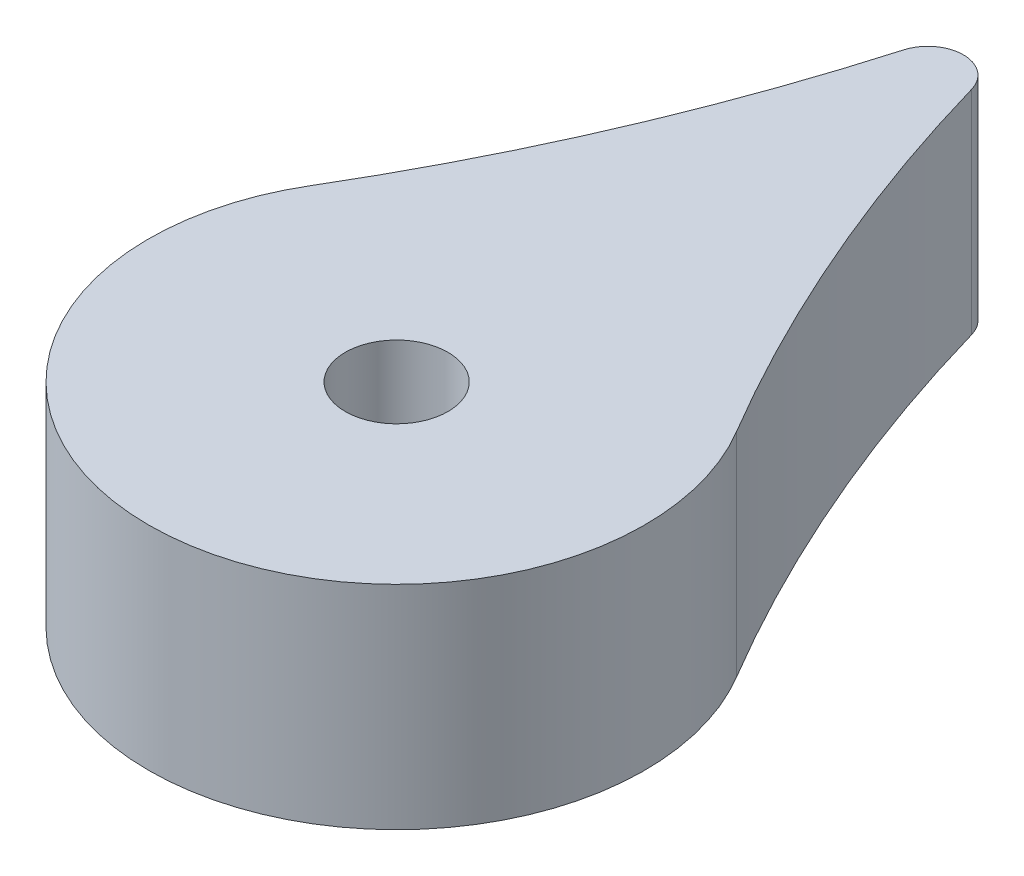
ISO-10303-21;
HEADER;
FILE_DESCRIPTION(('STEP AP214'),'2;1');
FILE_NAME('part.step','',(''),(''),'','','');
FILE_SCHEMA(('AUTOMOTIVE_DESIGN { 1 0 10303 214 1 1 1 1 }'));
ENDSEC;
DATA;
#1=APPLICATION_CONTEXT('core data for automotive mechanical design processes');
#2=APPLICATION_PROTOCOL_DEFINITION('international standard','automotive_design',2000,#1);
#3=PRODUCT_CONTEXT('',#1,'mechanical');
#4=PRODUCT('Part','Part','',(#3));
#5=PRODUCT_RELATED_PRODUCT_CATEGORY('part','',(#4));
#6=PRODUCT_DEFINITION_FORMATION('','',#4);
#7=PRODUCT_DEFINITION_CONTEXT('part definition',#1,'design');
#8=PRODUCT_DEFINITION('design','',#6,#7);
#9=PRODUCT_DEFINITION_SHAPE('','',#8);
#10=(LENGTH_UNIT() NAMED_UNIT(*) SI_UNIT(.MILLI.,.METRE.));
#11=(NAMED_UNIT(*) PLANE_ANGLE_UNIT() SI_UNIT($,.RADIAN.));
#12=(NAMED_UNIT(*) SI_UNIT($,.STERADIAN.) SOLID_ANGLE_UNIT());
#13=UNCERTAINTY_MEASURE_WITH_UNIT(LENGTH_MEASURE(1.E-05),#10,'distance_accuracy_value','');
#14=(GEOMETRIC_REPRESENTATION_CONTEXT(3) GLOBAL_UNCERTAINTY_ASSIGNED_CONTEXT((#13)) GLOBAL_UNIT_ASSIGNED_CONTEXT((#10,
#11,#12)) REPRESENTATION_CONTEXT('',''));
#15=CARTESIAN_POINT('',(0.,0.,0.));
#16=DIRECTION('',(0.,0.,1.));
#17=DIRECTION('',(1.,0.,0.));
#18=AXIS2_PLACEMENT_3D('',#15,#16,#17);
#19=CARTESIAN_POINT('',(0.,-3.,0.));
#20=DIRECTION('',(0.,1.,0.));
#21=DIRECTION('',(0.,0.,1.));
#22=AXIS2_PLACEMENT_3D('',#19,#20,#21);
#23=CYLINDRICAL_SURFACE('',#22,4.);
#24=CARTESIAN_POINT('',(0.,0.,0.));
#25=DIRECTION('',(0.,1.,0.));
#26=DIRECTION('',(0.,0.,1.));
#27=AXIS2_PLACEMENT_3D('',#24,#25,#26);
#28=CIRCLE('',#27,4.);
#29=CARTESIAN_POINT('',(-3.1224989991992,0.,-2.5));
#30=VERTEX_POINT('',#29);
#31=CARTESIAN_POINT('',(3.1224989991992,0.,-2.5));
#32=VERTEX_POINT('',#31);
#33=EDGE_CURVE('E115',#30,#32,#28,.T.);
#34=ORIENTED_EDGE('',*,*,#33,.T.);
#35=DIRECTION('',(0.,1.,0.));
#36=VECTOR('',#35,1.);
#37=CARTESIAN_POINT('',(3.1224989991992,-3.,-2.5));
#38=LINE('',#37,#36);
#39=CARTESIAN_POINT('',(3.1224989991992,-3.,-2.5));
#40=VERTEX_POINT('',#39);
#41=EDGE_CURVE('E11',#40,#32,#38,.T.);
#42=ORIENTED_EDGE('',*,*,#41,.F.);
#43=CARTESIAN_POINT('',(0.,-3.,0.));
#44=DIRECTION('',(0.,1.,0.));
#45=DIRECTION('',(0.,0.,1.));
#46=AXIS2_PLACEMENT_3D('',#43,#44,#45);
#47=CIRCLE('',#46,4.);
#48=CARTESIAN_POINT('',(-3.1224989991992,-3.,-2.5));
#49=VERTEX_POINT('',#48);
#50=EDGE_CURVE('E127',#49,#40,#47,.T.);
#51=ORIENTED_EDGE('',*,*,#50,.F.);
#52=DIRECTION('',(0.,1.,0.));
#53=VECTOR('',#52,1.);
#54=CARTESIAN_POINT('',(-3.1224989991992,-3.,-2.5));
#55=LINE('',#54,#53);
#56=EDGE_CURVE('E45',#49,#30,#55,.T.);
#57=ORIENTED_EDGE('',*,*,#56,.T.);
#58=EDGE_LOOP('',(#34,#42,#51,#57));
#59=FACE_BOUND('',#58,.T.);
#60=ADVANCED_FACE('F35',(#59),#23,.F.);
#61=CARTESIAN_POINT('',(-49.0121413529342,-3.,-29.1));
#62=DIRECTION('',(0.,1.,0.));
#63=DIRECTION('',(0.,0.,1.));
#64=AXIS2_PLACEMENT_3D('',#61,#62,#63);
#65=CYLINDRICAL_SURFACE('',#64,50.);
#66=DIRECTION('',(0.,1.,0.));
#67=VECTOR('',#66,1.);
#68=CARTESIAN_POINT('',(-6.01903490299191,-3.,-3.57368421052631));
#69=LINE('',#68,#67);
#70=CARTESIAN_POINT('',(-6.01903490299191,-3.,-3.57368421052631));
#71=VERTEX_POINT('',#70);
#72=CARTESIAN_POINT('',(-6.01903490299191,3.,-3.57368421052631));
#73=VERTEX_POINT('',#72);
#74=EDGE_CURVE('E39',#71,#73,#69,.T.);
#75=ORIENTED_EDGE('',*,*,#74,.T.);
#76=CARTESIAN_POINT('',(-49.0121413529342,3.,-29.1));
#77=DIRECTION('',(0.,1.,0.));
#78=DIRECTION('',(0.,0.,1.));
#79=AXIS2_PLACEMENT_3D('',#76,#77,#78);
#80=CIRCLE('',#79,50.);
#81=CARTESIAN_POINT('',(-0.961022379469295,3.,-15.2764705882353));
#82=VERTEX_POINT('',#81);
#83=EDGE_CURVE('E88',#73,#82,#80,.T.);
#84=ORIENTED_EDGE('',*,*,#83,.T.);
#85=DIRECTION('',(0.,1.,0.));
#86=VECTOR('',#85,1.);
#87=CARTESIAN_POINT('',(-0.961022379469295,-3.,-15.2764705882353));
#88=LINE('',#87,#86);
#89=CARTESIAN_POINT('',(-0.961022379469295,-3.,-15.2764705882353));
#90=VERTEX_POINT('',#89);
#91=EDGE_CURVE('E136',#90,#82,#88,.T.);
#92=ORIENTED_EDGE('',*,*,#91,.F.);
#93=CARTESIAN_POINT('',(-49.0121413529342,-3.,-29.1));
#94=DIRECTION('',(0.,1.,0.));
#95=DIRECTION('',(0.,0.,1.));
#96=AXIS2_PLACEMENT_3D('',#93,#94,#95);
#97=CIRCLE('',#96,50.);
#98=EDGE_CURVE('E91',#71,#90,#97,.T.);
#99=ORIENTED_EDGE('',*,*,#98,.F.);
#100=EDGE_LOOP('',(#75,#84,#92,#99));
#101=FACE_BOUND('',#100,.T.);
#102=ADVANCED_FACE('F37',(#101),#65,.F.);
#103=CARTESIAN_POINT('',(0.,-3.,-15.));
#104=DIRECTION('',(0.,1.,0.));
#105=DIRECTION('',(0.,0.,1.));
#106=AXIS2_PLACEMENT_3D('',#103,#104,#105);
#107=CYLINDRICAL_SURFACE('',#106,0.999999999999991);
#108=ORIENTED_EDGE('',*,*,#91,.T.);
#109=CARTESIAN_POINT('',(0.,3.,-15.));
#110=DIRECTION('',(0.,1.,0.));
#111=DIRECTION('',(0.,0.,1.));
#112=AXIS2_PLACEMENT_3D('',#109,#110,#111);
#113=CIRCLE('',#112,0.999999999999991);
#114=CARTESIAN_POINT('',(0.96102237946929,3.,-15.2764705882353));
#115=VERTEX_POINT('',#114);
#116=EDGE_CURVE('E106',#82,#115,#113,.F.);
#117=ORIENTED_EDGE('',*,*,#116,.T.);
#118=DIRECTION('',(0.,1.,0.));
#119=VECTOR('',#118,1.);
#120=CARTESIAN_POINT('',(0.96102237946929,-3.,-15.2764705882353));
#121=LINE('',#120,#119);
#122=CARTESIAN_POINT('',(0.96102237946929,-3.,-15.2764705882353));
#123=VERTEX_POINT('',#122);
#124=EDGE_CURVE('E138',#123,#115,#121,.T.);
#125=ORIENTED_EDGE('',*,*,#124,.F.);
#126=CARTESIAN_POINT('',(0.,-3.,-15.));
#127=DIRECTION('',(0.,1.,0.));
#128=DIRECTION('',(0.,0.,1.));
#129=AXIS2_PLACEMENT_3D('',#126,#127,#128);
#130=CIRCLE('',#129,0.999999999999991);
#131=EDGE_CURVE('E125',#90,#123,#130,.F.);
#132=ORIENTED_EDGE('',*,*,#131,.F.);
#133=EDGE_LOOP('',(#108,#117,#125,#132));
#134=FACE_BOUND('',#133,.T.);
#135=ADVANCED_FACE('F144',(#134),#107,.T.);
#136=CARTESIAN_POINT('',(49.0121413529342,-3.,-29.1));
#137=DIRECTION('',(0.,1.,0.));
#138=DIRECTION('',(0.,0.,1.));
#139=AXIS2_PLACEMENT_3D('',#136,#137,#138);
#140=CYLINDRICAL_SURFACE('',#139,50.);
#141=ORIENTED_EDGE('',*,*,#124,.T.);
#142=CARTESIAN_POINT('',(49.0121413529342,3.,-29.1));
#143=DIRECTION('',(0.,1.,0.));
#144=DIRECTION('',(0.,0.,1.));
#145=AXIS2_PLACEMENT_3D('',#142,#143,#144);
#146=CIRCLE('',#145,50.);
#147=CARTESIAN_POINT('',(6.01903490299191,3.,-3.57368421052631));
#148=VERTEX_POINT('',#147);
#149=EDGE_CURVE('E102',#148,#115,#146,.F.);
#150=ORIENTED_EDGE('',*,*,#149,.F.);
#151=DIRECTION('',(0.,1.,0.));
#152=VECTOR('',#151,1.);
#153=CARTESIAN_POINT('',(6.01903490299191,-3.,-3.57368421052631));
#154=LINE('',#153,#152);
#155=CARTESIAN_POINT('',(6.01903490299191,-3.,-3.57368421052631));
#156=VERTEX_POINT('',#155);
#157=EDGE_CURVE('E95',#156,#148,#154,.T.);
#158=ORIENTED_EDGE('',*,*,#157,.F.);
#159=CARTESIAN_POINT('',(49.0121413529342,-3.,-29.1));
#160=DIRECTION('',(0.,1.,0.));
#161=DIRECTION('',(0.,0.,1.));
#162=AXIS2_PLACEMENT_3D('',#159,#160,#161);
#163=CIRCLE('',#162,50.);
#164=EDGE_CURVE('E122',#156,#123,#163,.F.);
#165=ORIENTED_EDGE('',*,*,#164,.T.);
#166=EDGE_LOOP('',(#141,#150,#158,#165));
#167=FACE_BOUND('',#166,.T.);
#168=ADVANCED_FACE('F141',(#167),#140,.F.);
#169=CARTESIAN_POINT('',(0.,-3.,0.));
#170=DIRECTION('',(0.,1.,0.));
#171=DIRECTION('',(0.,0.,1.));
#172=AXIS2_PLACEMENT_3D('',#169,#170,#171);
#173=CYLINDRICAL_SURFACE('',#172,6.99999999999999);
#174=ORIENTED_EDGE('',*,*,#157,.T.);
#175=CARTESIAN_POINT('',(0.,3.,0.));
#176=DIRECTION('',(0.,1.,0.));
#177=DIRECTION('',(0.,0.,1.));
#178=AXIS2_PLACEMENT_3D('',#175,#176,#177);
#179=CIRCLE('',#178,6.99999999999999);
#180=EDGE_CURVE('E97',#73,#148,#179,.T.);
#181=ORIENTED_EDGE('',*,*,#180,.F.);
#182=ORIENTED_EDGE('',*,*,#74,.F.);
#183=CARTESIAN_POINT('',(0.,-3.,0.));
#184=DIRECTION('',(0.,1.,0.));
#185=DIRECTION('',(0.,0.,1.));
#186=AXIS2_PLACEMENT_3D('',#183,#184,#185);
#187=CIRCLE('',#186,6.99999999999999);
#188=EDGE_CURVE('E119',#71,#156,#187,.T.);
#189=ORIENTED_EDGE('',*,*,#188,.T.);
#190=EDGE_LOOP('',(#174,#181,#182,#189));
#191=FACE_BOUND('',#190,.T.);
#192=ADVANCED_FACE('F98',(#191),#173,.T.);
#193=CARTESIAN_POINT('',(0.,-3.,-2.5));
#194=DIRECTION('',(0.,0.,-1.));
#195=DIRECTION('',(-1.,0.,0.));
#196=AXIS2_PLACEMENT_3D('',#193,#194,#195);
#197=PLANE('',#196);
#198=DIRECTION('',(-1.,0.,0.));
#199=VECTOR('',#198,1.);
#200=CARTESIAN_POINT('',(0.,0.,-2.5));
#201=LINE('',#200,#199);
#202=EDGE_CURVE('E120',#32,#30,#201,.T.);
#203=ORIENTED_EDGE('',*,*,#202,.T.);
#204=ORIENTED_EDGE('',*,*,#56,.F.);
#205=DIRECTION('',(-1.,0.,0.));
#206=VECTOR('',#205,1.);
#207=CARTESIAN_POINT('',(0.,-3.,-2.5));
#208=LINE('',#207,#206);
#209=EDGE_CURVE('E52',#40,#49,#208,.T.);
#210=ORIENTED_EDGE('',*,*,#209,.F.);
#211=ORIENTED_EDGE('',*,*,#41,.T.);
#212=EDGE_LOOP('',(#203,#204,#210,#211));
#213=FACE_BOUND('',#212,.T.);
#214=ADVANCED_FACE('F150',(#213),#197,.F.);
#215=CARTESIAN_POINT('',(0.,-3.,0.));
#216=DIRECTION('',(0.,1.,0.));
#217=DIRECTION('',(0.,0.,1.));
#218=AXIS2_PLACEMENT_3D('',#215,#216,#217);
#219=PLANE('',#218);
#220=ORIENTED_EDGE('',*,*,#98,.T.);
#221=ORIENTED_EDGE('',*,*,#131,.T.);
#222=ORIENTED_EDGE('',*,*,#164,.F.);
#223=ORIENTED_EDGE('',*,*,#188,.F.);
#224=EDGE_LOOP('',(#220,#221,#222,#223));
#225=FACE_BOUND('',#224,.T.);
#226=ORIENTED_EDGE('',*,*,#50,.T.);
#227=ORIENTED_EDGE('',*,*,#209,.T.);
#228=EDGE_LOOP('',(#226,#227));
#229=FACE_BOUND('',#228,.T.);
#230=ADVANCED_FACE('F146',(#225,#229),#219,.F.);
#231=CARTESIAN_POINT('',(0.,3.,0.));
#232=DIRECTION('',(0.,-1.,0.));
#233=DIRECTION('',(0.,0.,-1.));
#234=AXIS2_PLACEMENT_3D('',#231,#232,#233);
#235=CYLINDRICAL_SURFACE('',#234,1.45);
#236=CARTESIAN_POINT('',(0.,3.,0.));
#237=DIRECTION('',(0.,1.,0.));
#238=DIRECTION('',(0.,0.,1.));
#239=AXIS2_PLACEMENT_3D('',#236,#237,#238);
#240=CIRCLE('',#239,1.45);
#241=CARTESIAN_POINT('',(0.,3.,1.45));
#242=VERTEX_POINT('',#241);
#243=EDGE_CURVE('E107',#242,#242,#240,.T.);
#244=ORIENTED_EDGE('',*,*,#243,.T.);
#245=EDGE_LOOP('',(#244));
#246=FACE_BOUND('',#245,.T.);
#247=CARTESIAN_POINT('',(0.,0.,0.));
#248=DIRECTION('',(0.,1.,0.));
#249=DIRECTION('',(0.,0.,1.));
#250=AXIS2_PLACEMENT_3D('',#247,#248,#249);
#251=CIRCLE('',#250,1.45);
#252=CARTESIAN_POINT('',(0.,0.,1.45));
#253=VERTEX_POINT('',#252);
#254=EDGE_CURVE('E110',#253,#253,#251,.T.);
#255=ORIENTED_EDGE('',*,*,#254,.F.);
#256=EDGE_LOOP('',(#255));
#257=FACE_BOUND('',#256,.T.);
#258=ADVANCED_FACE('F149',(#246,#257),#235,.F.);
#259=CARTESIAN_POINT('',(0.,3.,0.));
#260=DIRECTION('',(0.,1.,0.));
#261=DIRECTION('',(0.,0.,1.));
#262=AXIS2_PLACEMENT_3D('',#259,#260,#261);
#263=PLANE('',#262);
#264=ORIENTED_EDGE('',*,*,#243,.F.);
#265=EDGE_LOOP('',(#264));
#266=FACE_BOUND('',#265,.T.);
#267=ORIENTED_EDGE('',*,*,#83,.F.);
#268=ORIENTED_EDGE('',*,*,#180,.T.);
#269=ORIENTED_EDGE('',*,*,#149,.T.);
#270=ORIENTED_EDGE('',*,*,#116,.F.);
#271=EDGE_LOOP('',(#267,#268,#269,#270));
#272=FACE_BOUND('',#271,.T.);
#273=ADVANCED_FACE('F104',(#266,#272),#263,.T.);
#274=CARTESIAN_POINT('',(0.,0.,0.));
#275=DIRECTION('',(0.,1.,0.));
#276=DIRECTION('',(0.,0.,1.));
#277=AXIS2_PLACEMENT_3D('',#274,#275,#276);
#278=PLANE('',#277);
#279=ORIENTED_EDGE('',*,*,#33,.F.);
#280=ORIENTED_EDGE('',*,*,#202,.F.);
#281=EDGE_LOOP('',(#279,#280));
#282=FACE_BOUND('',#281,.T.);
#283=ORIENTED_EDGE('',*,*,#254,.T.);
#284=EDGE_LOOP('',(#283));
#285=FACE_BOUND('',#284,.T.);
#286=ADVANCED_FACE('F157',(#282,#285),#278,.F.);
#287=CLOSED_SHELL('',(#60,#102,#135,#168,#192,#214,#230,#258,#273,#286));
#288=MANIFOLD_SOLID_BREP('B2',#287);
#289=ADVANCED_BREP_SHAPE_REPRESENTATION('',(#18,#288),#14);
#290=SHAPE_DEFINITION_REPRESENTATION(#9,#289);
ENDSEC;
END-ISO-10303-21;
